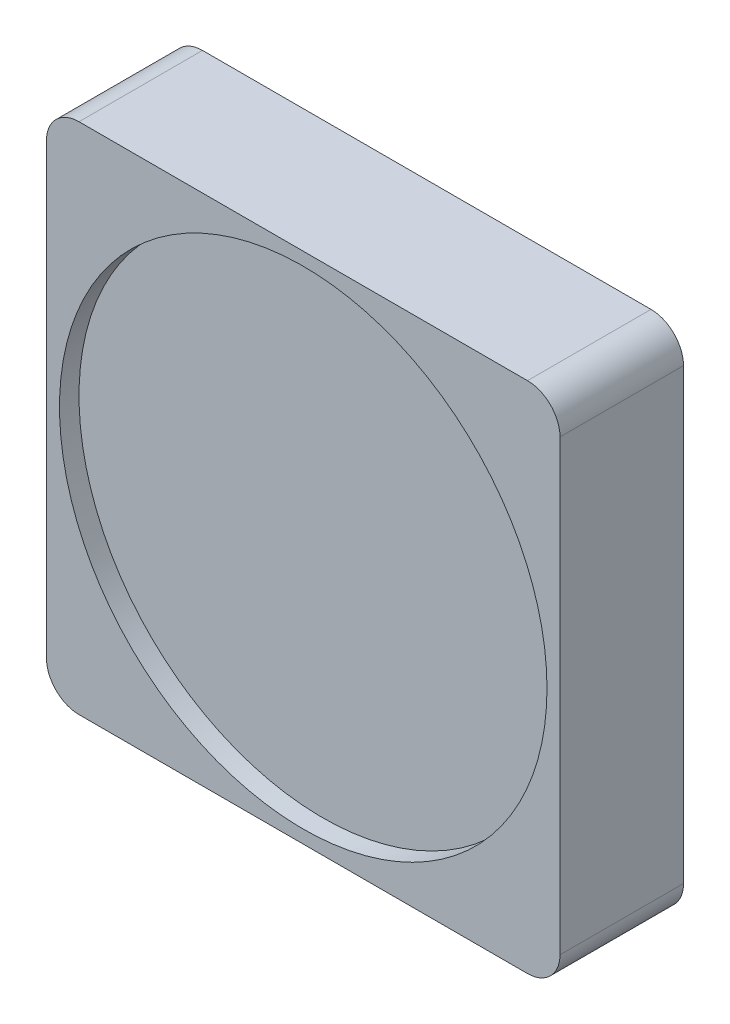
ISO-10303-21;
HEADER;
FILE_DESCRIPTION(('STEP AP214'),'2;1');
FILE_NAME('part.step','',(''),(''),'','','');
FILE_SCHEMA(('AUTOMOTIVE_DESIGN { 1 0 10303 214 1 1 1 1 }'));
ENDSEC;
DATA;
#1=APPLICATION_CONTEXT('core data for automotive mechanical design processes');
#2=APPLICATION_PROTOCOL_DEFINITION('international standard','automotive_design',2000,#1);
#3=PRODUCT_CONTEXT('',#1,'mechanical');
#4=PRODUCT('Part','Part','',(#3));
#5=PRODUCT_RELATED_PRODUCT_CATEGORY('part','',(#4));
#6=PRODUCT_DEFINITION_FORMATION('','',#4);
#7=PRODUCT_DEFINITION_CONTEXT('part definition',#1,'design');
#8=PRODUCT_DEFINITION('design','',#6,#7);
#9=PRODUCT_DEFINITION_SHAPE('','',#8);
#10=(LENGTH_UNIT() NAMED_UNIT(*) SI_UNIT(.MILLI.,.METRE.));
#11=(NAMED_UNIT(*) PLANE_ANGLE_UNIT() SI_UNIT($,.RADIAN.));
#12=(NAMED_UNIT(*) SI_UNIT($,.STERADIAN.) SOLID_ANGLE_UNIT());
#13=UNCERTAINTY_MEASURE_WITH_UNIT(LENGTH_MEASURE(1.E-05),#10,'distance_accuracy_value','');
#14=(GEOMETRIC_REPRESENTATION_CONTEXT(3) GLOBAL_UNCERTAINTY_ASSIGNED_CONTEXT((#13)) GLOBAL_UNIT_ASSIGNED_CONTEXT((#10,
#11,#12)) REPRESENTATION_CONTEXT('',''));
#15=CARTESIAN_POINT('',(0.,0.,0.));
#16=DIRECTION('',(0.,0.,1.));
#17=DIRECTION('',(1.,0.,0.));
#18=AXIS2_PLACEMENT_3D('',#15,#16,#17);
#19=CARTESIAN_POINT('',(0.,0.,38.));
#20=DIRECTION('',(1.,0.,0.));
#21=DIRECTION('',(0.,1.,0.));
#22=AXIS2_PLACEMENT_3D('',#19,#20,#21);
#23=PLANE('',#22);
#24=DIRECTION('',(0.,-1.,0.));
#25=VECTOR('',#24,1.);
#26=CARTESIAN_POINT('',(0.,0.,0.));
#27=LINE('',#26,#25);
#28=CARTESIAN_POINT('',(0.,-10.,0.));
#29=VERTEX_POINT('',#28);
#30=CARTESIAN_POINT('',(0.,-148.,0.));
#31=VERTEX_POINT('',#30);
#32=EDGE_CURVE('E162',#29,#31,#27,.T.);
#33=ORIENTED_EDGE('',*,*,#32,.T.);
#34=DIRECTION('',(0.,0.,-1.));
#35=VECTOR('',#34,1.);
#36=CARTESIAN_POINT('',(0.,-148.,38.));
#37=LINE('',#36,#35);
#38=CARTESIAN_POINT('',(0.,-148.,38.));
#39=VERTEX_POINT('',#38);
#40=EDGE_CURVE('E11',#31,#39,#37,.F.);
#41=ORIENTED_EDGE('',*,*,#40,.T.);
#42=DIRECTION('',(0.,-1.,0.));
#43=VECTOR('',#42,1.);
#44=CARTESIAN_POINT('',(0.,0.,38.));
#45=LINE('',#44,#43);
#46=CARTESIAN_POINT('',(0.,-10.,38.));
#47=VERTEX_POINT('',#46);
#48=EDGE_CURVE('E130',#47,#39,#45,.T.);
#49=ORIENTED_EDGE('',*,*,#48,.F.);
#50=DIRECTION('',(0.,0.,-1.));
#51=VECTOR('',#50,1.);
#52=CARTESIAN_POINT('',(0.,-10.,38.));
#53=LINE('',#52,#51);
#54=EDGE_CURVE('E46',#47,#29,#53,.T.);
#55=ORIENTED_EDGE('',*,*,#54,.T.);
#56=EDGE_LOOP('',(#33,#41,#49,#55));
#57=FACE_BOUND('',#56,.T.);
#58=ADVANCED_FACE('F38',(#57),#23,.F.);
#59=CARTESIAN_POINT('',(0.,-158.,38.));
#60=DIRECTION('',(0.,1.,0.));
#61=DIRECTION('',(0.,0.,1.));
#62=AXIS2_PLACEMENT_3D('',#59,#60,#61);
#63=PLANE('',#62);
#64=DIRECTION('',(1.,0.,0.));
#65=VECTOR('',#64,1.);
#66=CARTESIAN_POINT('',(0.,-158.,0.));
#67=LINE('',#66,#65);
#68=CARTESIAN_POINT('',(10.,-158.,0.));
#69=VERTEX_POINT('',#68);
#70=CARTESIAN_POINT('',(148.,-158.,0.));
#71=VERTEX_POINT('',#70);
#72=EDGE_CURVE('E135',#69,#71,#67,.T.);
#73=ORIENTED_EDGE('',*,*,#72,.T.);
#74=DIRECTION('',(0.,0.,-1.));
#75=VECTOR('',#74,1.);
#76=CARTESIAN_POINT('',(148.,-158.,38.));
#77=LINE('',#76,#75);
#78=CARTESIAN_POINT('',(148.,-158.,38.));
#79=VERTEX_POINT('',#78);
#80=EDGE_CURVE('E53',#71,#79,#77,.F.);
#81=ORIENTED_EDGE('',*,*,#80,.T.);
#82=DIRECTION('',(1.,0.,0.));
#83=VECTOR('',#82,1.);
#84=CARTESIAN_POINT('',(0.,-158.,38.));
#85=LINE('',#84,#83);
#86=CARTESIAN_POINT('',(10.,-158.,38.));
#87=VERTEX_POINT('',#86);
#88=EDGE_CURVE('E133',#87,#79,#85,.T.);
#89=ORIENTED_EDGE('',*,*,#88,.F.);
#90=DIRECTION('',(0.,0.,-1.));
#91=VECTOR('',#90,1.);
#92=CARTESIAN_POINT('',(10.,-158.,38.));
#93=LINE('',#92,#91);
#94=EDGE_CURVE('E154',#87,#69,#93,.T.);
#95=ORIENTED_EDGE('',*,*,#94,.T.);
#96=EDGE_LOOP('',(#73,#81,#89,#95));
#97=FACE_BOUND('',#96,.T.);
#98=ADVANCED_FACE('F193',(#97),#63,.F.);
#99=CARTESIAN_POINT('',(158.,0.,38.));
#100=DIRECTION('',(-1.,0.,0.));
#101=DIRECTION('',(0.,-1.,0.));
#102=AXIS2_PLACEMENT_3D('',#99,#100,#101);
#103=PLANE('',#102);
#104=DIRECTION('',(0.,1.,0.));
#105=VECTOR('',#104,1.);
#106=CARTESIAN_POINT('',(158.,0.,0.));
#107=LINE('',#106,#105);
#108=CARTESIAN_POINT('',(158.,-148.,0.));
#109=VERTEX_POINT('',#108);
#110=CARTESIAN_POINT('',(158.,-10.,0.));
#111=VERTEX_POINT('',#110);
#112=EDGE_CURVE('E131',#109,#111,#107,.T.);
#113=ORIENTED_EDGE('',*,*,#112,.T.);
#114=DIRECTION('',(0.,0.,-1.));
#115=VECTOR('',#114,1.);
#116=CARTESIAN_POINT('',(158.,-10.,38.));
#117=LINE('',#116,#115);
#118=CARTESIAN_POINT('',(158.,-10.,38.));
#119=VERTEX_POINT('',#118);
#120=EDGE_CURVE('E109',#111,#119,#117,.F.);
#121=ORIENTED_EDGE('',*,*,#120,.T.);
#122=DIRECTION('',(0.,1.,0.));
#123=VECTOR('',#122,1.);
#124=CARTESIAN_POINT('',(158.,0.,38.));
#125=LINE('',#124,#123);
#126=CARTESIAN_POINT('',(158.,-148.,38.));
#127=VERTEX_POINT('',#126);
#128=EDGE_CURVE('E174',#127,#119,#125,.T.);
#129=ORIENTED_EDGE('',*,*,#128,.F.);
#130=DIRECTION('',(0.,0.,-1.));
#131=VECTOR('',#130,1.);
#132=CARTESIAN_POINT('',(158.,-148.,38.));
#133=LINE('',#132,#131);
#134=EDGE_CURVE('E114',#127,#109,#133,.T.);
#135=ORIENTED_EDGE('',*,*,#134,.T.);
#136=EDGE_LOOP('',(#113,#121,#129,#135));
#137=FACE_BOUND('',#136,.T.);
#138=ADVANCED_FACE('F190',(#137),#103,.F.);
#139=CARTESIAN_POINT('',(0.,0.,38.));
#140=DIRECTION('',(0.,-1.,0.));
#141=DIRECTION('',(0.,0.,-1.));
#142=AXIS2_PLACEMENT_3D('',#139,#140,#141);
#143=PLANE('',#142);
#144=DIRECTION('',(-1.,0.,0.));
#145=VECTOR('',#144,1.);
#146=CARTESIAN_POINT('',(0.,0.,38.));
#147=LINE('',#146,#145);
#148=CARTESIAN_POINT('',(148.,0.,38.));
#149=VERTEX_POINT('',#148);
#150=CARTESIAN_POINT('',(10.,0.,38.));
#151=VERTEX_POINT('',#150);
#152=EDGE_CURVE('E124',#149,#151,#147,.T.);
#153=ORIENTED_EDGE('',*,*,#152,.F.);
#154=DIRECTION('',(0.,0.,-1.));
#155=VECTOR('',#154,1.);
#156=CARTESIAN_POINT('',(148.,0.,38.));
#157=LINE('',#156,#155);
#158=CARTESIAN_POINT('',(148.,0.,0.));
#159=VERTEX_POINT('',#158);
#160=EDGE_CURVE('E108',#149,#159,#157,.T.);
#161=ORIENTED_EDGE('',*,*,#160,.T.);
#162=DIRECTION('',(-1.,0.,0.));
#163=VECTOR('',#162,1.);
#164=CARTESIAN_POINT('',(0.,0.,0.));
#165=LINE('',#164,#163);
#166=CARTESIAN_POINT('',(10.,0.,0.));
#167=VERTEX_POINT('',#166);
#168=EDGE_CURVE('E121',#159,#167,#165,.T.);
#169=ORIENTED_EDGE('',*,*,#168,.T.);
#170=DIRECTION('',(0.,0.,-1.));
#171=VECTOR('',#170,1.);
#172=CARTESIAN_POINT('',(10.,0.,38.));
#173=LINE('',#172,#171);
#174=EDGE_CURVE('E126',#167,#151,#173,.F.);
#175=ORIENTED_EDGE('',*,*,#174,.T.);
#176=EDGE_LOOP('',(#153,#161,#169,#175));
#177=FACE_BOUND('',#176,.T.);
#178=ADVANCED_FACE('F120',(#177),#143,.F.);
#179=CARTESIAN_POINT('',(0.,0.,38.));
#180=DIRECTION('',(0.,0.,1.));
#181=DIRECTION('',(1.,0.,0.));
#182=AXIS2_PLACEMENT_3D('',#179,#180,#181);
#183=PLANE('',#182);
#184=CARTESIAN_POINT('',(79.,-79.,38.));
#185=DIRECTION('',(0.,0.,1.));
#186=DIRECTION('',(1.,0.,0.));
#187=AXIS2_PLACEMENT_3D('',#184,#185,#186);
#188=CIRCLE('',#187,75.);
#189=CARTESIAN_POINT('',(154.,-79.,38.));
#190=VERTEX_POINT('',#189);
#191=EDGE_CURVE('E170',#190,#190,#188,.T.);
#192=ORIENTED_EDGE('',*,*,#191,.F.);
#193=EDGE_LOOP('',(#192));
#194=FACE_BOUND('',#193,.T.);
#195=ORIENTED_EDGE('',*,*,#128,.T.);
#196=CARTESIAN_POINT('',(148.,-10.,38.));
#197=DIRECTION('',(0.,0.,1.));
#198=DIRECTION('',(1.,0.,0.));
#199=AXIS2_PLACEMENT_3D('',#196,#197,#198);
#200=CIRCLE('',#199,10.);
#201=EDGE_CURVE('E152',#119,#149,#200,.T.);
#202=ORIENTED_EDGE('',*,*,#201,.T.);
#203=ORIENTED_EDGE('',*,*,#152,.T.);
#204=CARTESIAN_POINT('',(10.,-10.,38.));
#205=DIRECTION('',(0.,0.,1.));
#206=DIRECTION('',(1.,0.,0.));
#207=AXIS2_PLACEMENT_3D('',#204,#205,#206);
#208=CIRCLE('',#207,10.);
#209=EDGE_CURVE('E147',#151,#47,#208,.T.);
#210=ORIENTED_EDGE('',*,*,#209,.T.);
#211=ORIENTED_EDGE('',*,*,#48,.T.);
#212=CARTESIAN_POINT('',(10.,-148.,38.));
#213=DIRECTION('',(0.,0.,1.));
#214=DIRECTION('',(1.,0.,0.));
#215=AXIS2_PLACEMENT_3D('',#212,#213,#214);
#216=CIRCLE('',#215,10.);
#217=EDGE_CURVE('E60',#39,#87,#216,.T.);
#218=ORIENTED_EDGE('',*,*,#217,.T.);
#219=ORIENTED_EDGE('',*,*,#88,.T.);
#220=CARTESIAN_POINT('',(148.,-148.,38.));
#221=DIRECTION('',(0.,0.,1.));
#222=DIRECTION('',(1.,0.,0.));
#223=AXIS2_PLACEMENT_3D('',#220,#221,#222);
#224=CIRCLE('',#223,10.);
#225=EDGE_CURVE('E150',#79,#127,#224,.T.);
#226=ORIENTED_EDGE('',*,*,#225,.T.);
#227=EDGE_LOOP('',(#195,#202,#203,#210,#211,#218,#219,#226));
#228=FACE_BOUND('',#227,.T.);
#229=ADVANCED_FACE('F183',(#194,#228),#183,.T.);
#230=CARTESIAN_POINT('',(0.,0.,0.));
#231=DIRECTION('',(0.,0.,1.));
#232=DIRECTION('',(1.,0.,0.));
#233=AXIS2_PLACEMENT_3D('',#230,#231,#232);
#234=PLANE('',#233);
#235=ORIENTED_EDGE('',*,*,#168,.F.);
#236=CARTESIAN_POINT('',(148.,-10.,0.));
#237=DIRECTION('',(0.,0.,1.));
#238=DIRECTION('',(1.,0.,0.));
#239=AXIS2_PLACEMENT_3D('',#236,#237,#238);
#240=CIRCLE('',#239,10.);
#241=EDGE_CURVE('E104',#159,#111,#240,.F.);
#242=ORIENTED_EDGE('',*,*,#241,.T.);
#243=ORIENTED_EDGE('',*,*,#112,.F.);
#244=CARTESIAN_POINT('',(148.,-148.,0.));
#245=DIRECTION('',(0.,0.,1.));
#246=DIRECTION('',(1.,0.,0.));
#247=AXIS2_PLACEMENT_3D('',#244,#245,#246);
#248=CIRCLE('',#247,10.);
#249=EDGE_CURVE('E115',#109,#71,#248,.F.);
#250=ORIENTED_EDGE('',*,*,#249,.T.);
#251=ORIENTED_EDGE('',*,*,#72,.F.);
#252=CARTESIAN_POINT('',(10.,-148.,0.));
#253=DIRECTION('',(0.,0.,1.));
#254=DIRECTION('',(1.,0.,0.));
#255=AXIS2_PLACEMENT_3D('',#252,#253,#254);
#256=CIRCLE('',#255,10.);
#257=EDGE_CURVE('E141',#69,#31,#256,.F.);
#258=ORIENTED_EDGE('',*,*,#257,.T.);
#259=ORIENTED_EDGE('',*,*,#32,.F.);
#260=CARTESIAN_POINT('',(10.,-10.,0.));
#261=DIRECTION('',(0.,0.,1.));
#262=DIRECTION('',(1.,0.,0.));
#263=AXIS2_PLACEMENT_3D('',#260,#261,#262);
#264=CIRCLE('',#263,10.);
#265=EDGE_CURVE('E125',#29,#167,#264,.F.);
#266=ORIENTED_EDGE('',*,*,#265,.T.);
#267=EDGE_LOOP('',(#235,#242,#243,#250,#251,#258,#259,#266));
#268=FACE_BOUND('',#267,.T.);
#269=ADVANCED_FACE('F128',(#268),#234,.F.);
#270=CARTESIAN_POINT('',(79.,-79.,32.));
#271=DIRECTION('',(0.,0.,1.));
#272=DIRECTION('',(1.,0.,0.));
#273=AXIS2_PLACEMENT_3D('',#270,#271,#272);
#274=CYLINDRICAL_SURFACE('',#273,75.);
#275=CARTESIAN_POINT('',(79.,-79.,32.));
#276=DIRECTION('',(0.,0.,1.));
#277=DIRECTION('',(1.,0.,0.));
#278=AXIS2_PLACEMENT_3D('',#275,#276,#277);
#279=CIRCLE('',#278,75.);
#280=CARTESIAN_POINT('',(154.,-79.,32.));
#281=VERTEX_POINT('',#280);
#282=EDGE_CURVE('E167',#281,#281,#279,.T.);
#283=ORIENTED_EDGE('',*,*,#282,.F.);
#284=EDGE_LOOP('',(#283));
#285=FACE_BOUND('',#284,.T.);
#286=ORIENTED_EDGE('',*,*,#191,.T.);
#287=EDGE_LOOP('',(#286));
#288=FACE_BOUND('',#287,.T.);
#289=ADVANCED_FACE('F181',(#285,#288),#274,.F.);
#290=CARTESIAN_POINT('',(79.,-79.,32.));
#291=DIRECTION('',(0.,0.,1.));
#292=DIRECTION('',(1.,0.,0.));
#293=AXIS2_PLACEMENT_3D('',#290,#291,#292);
#294=PLANE('',#293);
#295=ORIENTED_EDGE('',*,*,#282,.T.);
#296=EDGE_LOOP('',(#295));
#297=FACE_BOUND('',#296,.T.);
#298=ADVANCED_FACE('F211',(#297),#294,.T.);
#299=CARTESIAN_POINT('',(148.,-10.,38.));
#300=DIRECTION('',(0.,0.,-1.));
#301=DIRECTION('',(-1.,0.,0.));
#302=AXIS2_PLACEMENT_3D('',#299,#300,#301);
#303=CYLINDRICAL_SURFACE('',#302,10.);
#304=ORIENTED_EDGE('',*,*,#201,.F.);
#305=ORIENTED_EDGE('',*,*,#120,.F.);
#306=ORIENTED_EDGE('',*,*,#241,.F.);
#307=ORIENTED_EDGE('',*,*,#160,.F.);
#308=EDGE_LOOP('',(#304,#305,#306,#307));
#309=FACE_BOUND('',#308,.T.);
#310=ADVANCED_FACE('F107',(#309),#303,.T.);
#311=CARTESIAN_POINT('',(148.,-148.,38.));
#312=DIRECTION('',(0.,0.,-1.));
#313=DIRECTION('',(-1.,0.,0.));
#314=AXIS2_PLACEMENT_3D('',#311,#312,#313);
#315=CYLINDRICAL_SURFACE('',#314,10.);
#316=ORIENTED_EDGE('',*,*,#225,.F.);
#317=ORIENTED_EDGE('',*,*,#80,.F.);
#318=ORIENTED_EDGE('',*,*,#249,.F.);
#319=ORIENTED_EDGE('',*,*,#134,.F.);
#320=EDGE_LOOP('',(#316,#317,#318,#319));
#321=FACE_BOUND('',#320,.T.);
#322=ADVANCED_FACE('F192',(#321),#315,.T.);
#323=CARTESIAN_POINT('',(10.,-148.,38.));
#324=DIRECTION('',(0.,0.,-1.));
#325=DIRECTION('',(-1.,0.,0.));
#326=AXIS2_PLACEMENT_3D('',#323,#324,#325);
#327=CYLINDRICAL_SURFACE('',#326,10.);
#328=ORIENTED_EDGE('',*,*,#217,.F.);
#329=ORIENTED_EDGE('',*,*,#40,.F.);
#330=ORIENTED_EDGE('',*,*,#257,.F.);
#331=ORIENTED_EDGE('',*,*,#94,.F.);
#332=EDGE_LOOP('',(#328,#329,#330,#331));
#333=FACE_BOUND('',#332,.T.);
#334=ADVANCED_FACE('F196',(#333),#327,.T.);
#335=CARTESIAN_POINT('',(10.,-10.,38.));
#336=DIRECTION('',(0.,0.,-1.));
#337=DIRECTION('',(-1.,0.,0.));
#338=AXIS2_PLACEMENT_3D('',#335,#336,#337);
#339=CYLINDRICAL_SURFACE('',#338,10.);
#340=ORIENTED_EDGE('',*,*,#209,.F.);
#341=ORIENTED_EDGE('',*,*,#174,.F.);
#342=ORIENTED_EDGE('',*,*,#265,.F.);
#343=ORIENTED_EDGE('',*,*,#54,.F.);
#344=EDGE_LOOP('',(#340,#341,#342,#343));
#345=FACE_BOUND('',#344,.T.);
#346=ADVANCED_FACE('F40',(#345),#339,.T.);
#347=CLOSED_SHELL('',(#58,#98,#138,#178,#229,#269,#289,#298,#310,#322,#334,#346));
#348=MANIFOLD_SOLID_BREP('B2',#347);
#349=ADVANCED_BREP_SHAPE_REPRESENTATION('',(#18,#348),#14);
#350=SHAPE_DEFINITION_REPRESENTATION(#9,#349);
ENDSEC;
END-ISO-10303-21;
